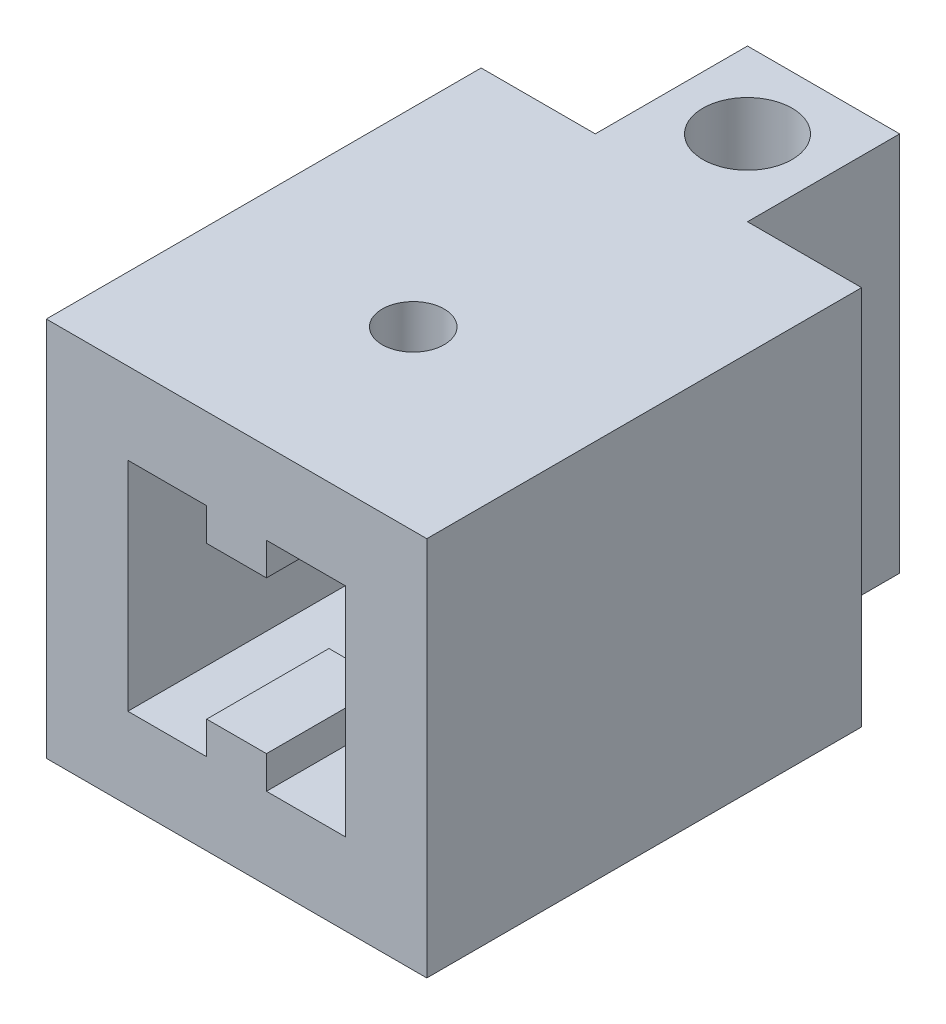
ISO-10303-21;
HEADER;
FILE_DESCRIPTION(('STEP AP214'),'2;1');
FILE_NAME('part.step','',(''),(''),'','','');
FILE_SCHEMA(('AUTOMOTIVE_DESIGN { 1 0 10303 214 1 1 1 1 }'));
ENDSEC;
DATA;
#1=APPLICATION_CONTEXT('core data for automotive mechanical design processes');
#2=APPLICATION_PROTOCOL_DEFINITION('international standard','automotive_design',2000,#1);
#3=PRODUCT_CONTEXT('',#1,'mechanical');
#4=PRODUCT('Part','Part','',(#3));
#5=PRODUCT_RELATED_PRODUCT_CATEGORY('part','',(#4));
#6=PRODUCT_DEFINITION_FORMATION('','',#4);
#7=PRODUCT_DEFINITION_CONTEXT('part definition',#1,'design');
#8=PRODUCT_DEFINITION('design','',#6,#7);
#9=PRODUCT_DEFINITION_SHAPE('','',#8);
#10=(LENGTH_UNIT() NAMED_UNIT(*) SI_UNIT(.MILLI.,.METRE.));
#11=(NAMED_UNIT(*) PLANE_ANGLE_UNIT() SI_UNIT($,.RADIAN.));
#12=(NAMED_UNIT(*) SI_UNIT($,.STERADIAN.) SOLID_ANGLE_UNIT());
#13=UNCERTAINTY_MEASURE_WITH_UNIT(LENGTH_MEASURE(1.E-05),#10,'distance_accuracy_value','');
#14=(GEOMETRIC_REPRESENTATION_CONTEXT(3) GLOBAL_UNCERTAINTY_ASSIGNED_CONTEXT((#13)) GLOBAL_UNIT_ASSIGNED_CONTEXT((#10,
#11,#12)) REPRESENTATION_CONTEXT('',''));
#15=CARTESIAN_POINT('',(0.,0.,0.));
#16=DIRECTION('',(0.,0.,1.));
#17=DIRECTION('',(1.,0.,0.));
#18=AXIS2_PLACEMENT_3D('',#15,#16,#17);
#19=CARTESIAN_POINT('',(0.,0.,-40.));
#20=DIRECTION('',(0.,0.,-1.));
#21=DIRECTION('',(-1.,0.,0.));
#22=AXIS2_PLACEMENT_3D('',#19,#20,#21);
#23=PLANE('',#22);
#24=DIRECTION('',(0.,1.,0.));
#25=VECTOR('',#24,1.);
#26=CARTESIAN_POINT('',(-7.,-17.5,-40.));
#27=LINE('',#26,#25);
#28=CARTESIAN_POINT('',(-7.,-17.5,-40.));
#29=VERTEX_POINT('',#28);
#30=CARTESIAN_POINT('',(-7.,17.5,-40.));
#31=VERTEX_POINT('',#30);
#32=EDGE_CURVE('E249',#29,#31,#27,.T.);
#33=ORIENTED_EDGE('',*,*,#32,.F.);
#34=DIRECTION('',(1.,0.,0.));
#35=VECTOR('',#34,1.);
#36=CARTESIAN_POINT('',(-17.5,-17.5,-40.));
#37=LINE('',#36,#35);
#38=CARTESIAN_POINT('',(-17.5,-17.5,-40.));
#39=VERTEX_POINT('',#38);
#40=EDGE_CURVE('E421',#39,#29,#37,.T.);
#41=ORIENTED_EDGE('',*,*,#40,.F.);
#42=DIRECTION('',(0.,-1.,0.));
#43=VECTOR('',#42,1.);
#44=CARTESIAN_POINT('',(-17.5,-17.5,-40.));
#45=LINE('',#44,#43);
#46=CARTESIAN_POINT('',(-17.5,17.5,-40.));
#47=VERTEX_POINT('',#46);
#48=EDGE_CURVE('E417',#47,#39,#45,.T.);
#49=ORIENTED_EDGE('',*,*,#48,.F.);
#50=DIRECTION('',(-1.,0.,0.));
#51=VECTOR('',#50,1.);
#52=CARTESIAN_POINT('',(-17.5,17.5,-40.));
#53=LINE('',#52,#51);
#54=EDGE_CURVE('E57',#31,#47,#53,.T.);
#55=ORIENTED_EDGE('',*,*,#54,.F.);
#56=EDGE_LOOP('',(#33,#41,#49,#55));
#57=FACE_BOUND('',#56,.T.);
#58=ADVANCED_FACE('F40',(#57),#23,.T.);
#59=CARTESIAN_POINT('',(2.75,0.,-32.5));
#60=DIRECTION('',(-1.,0.,0.));
#61=DIRECTION('',(0.,-1.,0.));
#62=AXIS2_PLACEMENT_3D('',#59,#60,#61);
#63=PLANE('',#62);
#64=DIRECTION('',(0.,0.,1.));
#65=VECTOR('',#64,1.);
#66=CARTESIAN_POINT('',(2.75,-10.,-32.5));
#67=LINE('',#66,#65);
#68=CARTESIAN_POINT('',(2.75,-10.,-11.25));
#69=VERTEX_POINT('',#68);
#70=CARTESIAN_POINT('',(2.75,-10.,0.));
#71=VERTEX_POINT('',#70);
#72=EDGE_CURVE('E394',#69,#71,#67,.T.);
#73=ORIENTED_EDGE('',*,*,#72,.F.);
#74=DIRECTION('',(0.,1.,0.));
#75=VECTOR('',#74,1.);
#76=CARTESIAN_POINT('',(2.75,-10.,-11.25));
#77=LINE('',#76,#75);
#78=CARTESIAN_POINT('',(2.75,-7.,-11.25));
#79=VERTEX_POINT('',#78);
#80=EDGE_CURVE('E271',#69,#79,#77,.T.);
#81=ORIENTED_EDGE('',*,*,#80,.T.);
#82=DIRECTION('',(0.,0.,1.));
#83=VECTOR('',#82,1.);
#84=CARTESIAN_POINT('',(2.75,-7.,-32.5));
#85=LINE('',#84,#83);
#86=CARTESIAN_POINT('',(2.75,-7.,0.));
#87=VERTEX_POINT('',#86);
#88=EDGE_CURVE('E398',#79,#87,#85,.T.);
#89=ORIENTED_EDGE('',*,*,#88,.T.);
#90=DIRECTION('',(0.,-1.,0.));
#91=VECTOR('',#90,1.);
#92=CARTESIAN_POINT('',(2.75,0.,0.));
#93=LINE('',#92,#91);
#94=EDGE_CURVE('E350',#87,#71,#93,.T.);
#95=ORIENTED_EDGE('',*,*,#94,.T.);
#96=EDGE_LOOP('',(#73,#81,#89,#95));
#97=FACE_BOUND('',#96,.T.);
#98=ADVANCED_FACE('F474',(#97),#63,.F.);
#99=CARTESIAN_POINT('',(0.,-7.,-32.5));
#100=DIRECTION('',(0.,-1.,0.));
#101=DIRECTION('',(1.,0.,0.));
#102=AXIS2_PLACEMENT_3D('',#99,#100,#101);
#103=PLANE('',#102);
#104=ORIENTED_EDGE('',*,*,#88,.F.);
#105=DIRECTION('',(1.,0.,0.));
#106=VECTOR('',#105,1.);
#107=CARTESIAN_POINT('',(-2.75,-7.,-11.25));
#108=LINE('',#107,#106);
#109=CARTESIAN_POINT('',(-2.75,-7.,-11.25));
#110=VERTEX_POINT('',#109);
#111=EDGE_CURVE('E264',#110,#79,#108,.T.);
#112=ORIENTED_EDGE('',*,*,#111,.F.);
#113=DIRECTION('',(0.,0.,1.));
#114=VECTOR('',#113,1.);
#115=CARTESIAN_POINT('',(-2.75,-7.,-32.5));
#116=LINE('',#115,#114);
#117=CARTESIAN_POINT('',(-2.75,-7.,0.));
#118=VERTEX_POINT('',#117);
#119=EDGE_CURVE('E402',#110,#118,#116,.T.);
#120=ORIENTED_EDGE('',*,*,#119,.T.);
#121=DIRECTION('',(1.,0.,0.));
#122=VECTOR('',#121,1.);
#123=CARTESIAN_POINT('',(0.,-7.,0.));
#124=LINE('',#123,#122);
#125=EDGE_CURVE('E347',#118,#87,#124,.T.);
#126=ORIENTED_EDGE('',*,*,#125,.T.);
#127=EDGE_LOOP('',(#104,#112,#120,#126));
#128=FACE_BOUND('',#127,.T.);
#129=ADVANCED_FACE('F479',(#128),#103,.F.);
#130=CARTESIAN_POINT('',(-2.75,0.,-32.5));
#131=DIRECTION('',(-1.,0.,0.));
#132=DIRECTION('',(0.,-1.,0.));
#133=AXIS2_PLACEMENT_3D('',#130,#131,#132);
#134=PLANE('',#133);
#135=DIRECTION('',(0.,1.,0.));
#136=VECTOR('',#135,1.);
#137=CARTESIAN_POINT('',(-2.75,-10.,-11.25));
#138=LINE('',#137,#136);
#139=CARTESIAN_POINT('',(-2.75,-10.,-11.25));
#140=VERTEX_POINT('',#139);
#141=EDGE_CURVE('E274',#140,#110,#138,.T.);
#142=ORIENTED_EDGE('',*,*,#141,.F.);
#143=DIRECTION('',(0.,0.,1.));
#144=VECTOR('',#143,1.);
#145=CARTESIAN_POINT('',(-2.75,-10.,-32.5));
#146=LINE('',#145,#144);
#147=CARTESIAN_POINT('',(-2.75,-10.,0.));
#148=VERTEX_POINT('',#147);
#149=EDGE_CURVE('E406',#140,#148,#146,.T.);
#150=ORIENTED_EDGE('',*,*,#149,.T.);
#151=DIRECTION('',(0.,-1.,0.));
#152=VECTOR('',#151,1.);
#153=CARTESIAN_POINT('',(-2.75,0.,0.));
#154=LINE('',#153,#152);
#155=EDGE_CURVE('E344',#118,#148,#154,.T.);
#156=ORIENTED_EDGE('',*,*,#155,.F.);
#157=ORIENTED_EDGE('',*,*,#119,.F.);
#158=EDGE_LOOP('',(#142,#150,#156,#157));
#159=FACE_BOUND('',#158,.T.);
#160=ADVANCED_FACE('F512',(#159),#134,.T.);
#161=CARTESIAN_POINT('',(-2.75,0.,-32.5));
#162=DIRECTION('',(-1.,0.,0.));
#163=DIRECTION('',(0.,-1.,0.));
#164=AXIS2_PLACEMENT_3D('',#161,#162,#163);
#165=PLANE('',#164);
#166=DIRECTION('',(0.,-1.,0.));
#167=VECTOR('',#166,1.);
#168=CARTESIAN_POINT('',(-2.75,10.,-11.25));
#169=LINE('',#168,#167);
#170=CARTESIAN_POINT('',(-2.75,10.,-11.25));
#171=VERTEX_POINT('',#170);
#172=CARTESIAN_POINT('',(-2.75,7.,-11.25));
#173=VERTEX_POINT('',#172);
#174=EDGE_CURVE('E290',#171,#173,#169,.T.);
#175=ORIENTED_EDGE('',*,*,#174,.T.);
#176=DIRECTION('',(0.,0.,1.));
#177=VECTOR('',#176,1.);
#178=CARTESIAN_POINT('',(-2.75,7.,-32.5));
#179=LINE('',#178,#177);
#180=CARTESIAN_POINT('',(-2.75,7.,0.));
#181=VERTEX_POINT('',#180);
#182=EDGE_CURVE('E378',#173,#181,#179,.T.);
#183=ORIENTED_EDGE('',*,*,#182,.T.);
#184=DIRECTION('',(0.,-1.,0.));
#185=VECTOR('',#184,1.);
#186=CARTESIAN_POINT('',(-2.75,0.,0.));
#187=LINE('',#186,#185);
#188=CARTESIAN_POINT('',(-2.75,10.,0.));
#189=VERTEX_POINT('',#188);
#190=EDGE_CURVE('E307',#189,#181,#187,.T.);
#191=ORIENTED_EDGE('',*,*,#190,.F.);
#192=DIRECTION('',(0.,0.,1.));
#193=VECTOR('',#192,1.);
#194=CARTESIAN_POINT('',(-2.75,10.,-32.5));
#195=LINE('',#194,#193);
#196=EDGE_CURVE('E374',#171,#189,#195,.T.);
#197=ORIENTED_EDGE('',*,*,#196,.F.);
#198=EDGE_LOOP('',(#175,#183,#191,#197));
#199=FACE_BOUND('',#198,.T.);
#200=ADVANCED_FACE('F498',(#199),#165,.T.);
#201=CARTESIAN_POINT('',(0.,7.,-32.5));
#202=DIRECTION('',(0.,-1.,0.));
#203=DIRECTION('',(0.,0.,-1.));
#204=AXIS2_PLACEMENT_3D('',#201,#202,#203);
#205=PLANE('',#204);
#206=DIRECTION('',(-1.,0.,0.));
#207=VECTOR('',#206,1.);
#208=CARTESIAN_POINT('',(-2.75,7.,-11.25));
#209=LINE('',#208,#207);
#210=CARTESIAN_POINT('',(2.75,7.,-11.25));
#211=VERTEX_POINT('',#210);
#212=EDGE_CURVE('E276',#211,#173,#209,.T.);
#213=ORIENTED_EDGE('',*,*,#212,.F.);
#214=DIRECTION('',(0.,0.,1.));
#215=VECTOR('',#214,1.);
#216=CARTESIAN_POINT('',(2.75,7.,-32.5));
#217=LINE('',#216,#215);
#218=CARTESIAN_POINT('',(2.75,7.,0.));
#219=VERTEX_POINT('',#218);
#220=EDGE_CURVE('E382',#211,#219,#217,.T.);
#221=ORIENTED_EDGE('',*,*,#220,.T.);
#222=DIRECTION('',(1.,0.,0.));
#223=VECTOR('',#222,1.);
#224=CARTESIAN_POINT('',(0.,7.,0.));
#225=LINE('',#224,#223);
#226=EDGE_CURVE('E365',#181,#219,#225,.T.);
#227=ORIENTED_EDGE('',*,*,#226,.F.);
#228=ORIENTED_EDGE('',*,*,#182,.F.);
#229=EDGE_LOOP('',(#213,#221,#227,#228));
#230=FACE_BOUND('',#229,.T.);
#231=ADVANCED_FACE('F533',(#230),#205,.T.);
#232=CARTESIAN_POINT('',(2.75,0.,-32.5));
#233=DIRECTION('',(-1.,0.,0.));
#234=DIRECTION('',(0.,-1.,0.));
#235=AXIS2_PLACEMENT_3D('',#232,#233,#234);
#236=PLANE('',#235);
#237=ORIENTED_EDGE('',*,*,#220,.F.);
#238=DIRECTION('',(0.,-1.,0.));
#239=VECTOR('',#238,1.);
#240=CARTESIAN_POINT('',(2.75,10.,-11.25));
#241=LINE('',#240,#239);
#242=CARTESIAN_POINT('',(2.75,10.,-11.25));
#243=VERTEX_POINT('',#242);
#244=EDGE_CURVE('E293',#243,#211,#241,.T.);
#245=ORIENTED_EDGE('',*,*,#244,.F.);
#246=DIRECTION('',(0.,0.,1.));
#247=VECTOR('',#246,1.);
#248=CARTESIAN_POINT('',(2.75,10.,-32.5));
#249=LINE('',#248,#247);
#250=CARTESIAN_POINT('',(2.75,10.,0.));
#251=VERTEX_POINT('',#250);
#252=EDGE_CURVE('E386',#243,#251,#249,.T.);
#253=ORIENTED_EDGE('',*,*,#252,.T.);
#254=DIRECTION('',(0.,-1.,0.));
#255=VECTOR('',#254,1.);
#256=CARTESIAN_POINT('',(2.75,0.,0.));
#257=LINE('',#256,#255);
#258=EDGE_CURVE('E362',#251,#219,#257,.T.);
#259=ORIENTED_EDGE('',*,*,#258,.T.);
#260=EDGE_LOOP('',(#237,#245,#253,#259));
#261=FACE_BOUND('',#260,.T.);
#262=ADVANCED_FACE('F530',(#261),#236,.F.);
#263=CARTESIAN_POINT('',(0.,0.,0.));
#264=DIRECTION('',(0.,0.,-1.));
#265=DIRECTION('',(-1.,0.,0.));
#266=AXIS2_PLACEMENT_3D('',#263,#264,#265);
#267=PLANE('',#266);
#268=DIRECTION('',(0.,1.,0.));
#269=VECTOR('',#268,1.);
#270=CARTESIAN_POINT('',(17.5,-17.5,0.));
#271=LINE('',#270,#269);
#272=CARTESIAN_POINT('',(17.5,-17.5,0.));
#273=VERTEX_POINT('',#272);
#274=CARTESIAN_POINT('',(17.5,17.5,0.));
#275=VERTEX_POINT('',#274);
#276=EDGE_CURVE('E373',#273,#275,#271,.T.);
#277=ORIENTED_EDGE('',*,*,#276,.T.);
#278=DIRECTION('',(-1.,0.,0.));
#279=VECTOR('',#278,1.);
#280=CARTESIAN_POINT('',(-17.5,17.5,0.));
#281=LINE('',#280,#279);
#282=CARTESIAN_POINT('',(-17.5,17.5,0.));
#283=VERTEX_POINT('',#282);
#284=EDGE_CURVE('E427',#275,#283,#281,.T.);
#285=ORIENTED_EDGE('',*,*,#284,.T.);
#286=DIRECTION('',(0.,-1.,0.));
#287=VECTOR('',#286,1.);
#288=CARTESIAN_POINT('',(-17.5,-17.5,0.));
#289=LINE('',#288,#287);
#290=CARTESIAN_POINT('',(-17.5,-17.5,0.));
#291=VERTEX_POINT('',#290);
#292=EDGE_CURVE('E430',#283,#291,#289,.T.);
#293=ORIENTED_EDGE('',*,*,#292,.T.);
#294=DIRECTION('',(1.,0.,0.));
#295=VECTOR('',#294,1.);
#296=CARTESIAN_POINT('',(-17.5,-17.5,0.));
#297=LINE('',#296,#295);
#298=EDGE_CURVE('E414',#291,#273,#297,.T.);
#299=ORIENTED_EDGE('',*,*,#298,.T.);
#300=EDGE_LOOP('',(#277,#285,#293,#299));
#301=FACE_BOUND('',#300,.T.);
#302=DIRECTION('',(1.,0.,0.));
#303=VECTOR('',#302,1.);
#304=CARTESIAN_POINT('',(0.,10.,0.));
#305=LINE('',#304,#303);
#306=CARTESIAN_POINT('',(-10.,10.,0.));
#307=VERTEX_POINT('',#306);
#308=EDGE_CURVE('E295',#307,#189,#305,.T.);
#309=ORIENTED_EDGE('',*,*,#308,.T.);
#310=ORIENTED_EDGE('',*,*,#190,.T.);
#311=ORIENTED_EDGE('',*,*,#226,.T.);
#312=ORIENTED_EDGE('',*,*,#258,.F.);
#313=DIRECTION('',(1.,0.,0.));
#314=VECTOR('',#313,1.);
#315=CARTESIAN_POINT('',(0.,10.,0.));
#316=LINE('',#315,#314);
#317=CARTESIAN_POINT('',(10.,10.,0.));
#318=VERTEX_POINT('',#317);
#319=EDGE_CURVE('E359',#251,#318,#316,.T.);
#320=ORIENTED_EDGE('',*,*,#319,.T.);
#321=DIRECTION('',(0.,-1.,0.));
#322=VECTOR('',#321,1.);
#323=CARTESIAN_POINT('',(10.,0.,0.));
#324=LINE('',#323,#322);
#325=CARTESIAN_POINT('',(10.,-10.,0.));
#326=VERTEX_POINT('',#325);
#327=EDGE_CURVE('E356',#318,#326,#324,.T.);
#328=ORIENTED_EDGE('',*,*,#327,.T.);
#329=DIRECTION('',(1.,0.,0.));
#330=VECTOR('',#329,1.);
#331=CARTESIAN_POINT('',(0.,-10.,0.));
#332=LINE('',#331,#330);
#333=EDGE_CURVE('E353',#71,#326,#332,.T.);
#334=ORIENTED_EDGE('',*,*,#333,.F.);
#335=ORIENTED_EDGE('',*,*,#94,.F.);
#336=ORIENTED_EDGE('',*,*,#125,.F.);
#337=ORIENTED_EDGE('',*,*,#155,.T.);
#338=DIRECTION('',(1.,0.,0.));
#339=VECTOR('',#338,1.);
#340=CARTESIAN_POINT('',(0.,-10.,0.));
#341=LINE('',#340,#339);
#342=CARTESIAN_POINT('',(-10.,-10.,0.));
#343=VERTEX_POINT('',#342);
#344=EDGE_CURVE('E341',#343,#148,#341,.T.);
#345=ORIENTED_EDGE('',*,*,#344,.F.);
#346=DIRECTION('',(0.,-1.,0.));
#347=VECTOR('',#346,1.);
#348=CARTESIAN_POINT('',(-10.,0.,0.));
#349=LINE('',#348,#347);
#350=EDGE_CURVE('E338',#307,#343,#349,.T.);
#351=ORIENTED_EDGE('',*,*,#350,.F.);
#352=EDGE_LOOP('',(#309,#310,#311,#312,#320,#328,#334,#335,#336,#337,#345,#351));
#353=FACE_BOUND('',#352,.T.);
#354=ADVANCED_FACE('F444',(#301,#353),#267,.F.);
#355=CARTESIAN_POINT('',(17.5,-17.5,-40.));
#356=DIRECTION('',(1.,0.,0.));
#357=DIRECTION('',(0.,0.,-1.));
#358=AXIS2_PLACEMENT_3D('',#355,#356,#357);
#359=PLANE('',#358);
#360=ORIENTED_EDGE('',*,*,#276,.F.);
#361=DIRECTION('',(0.,0.,1.));
#362=VECTOR('',#361,1.);
#363=CARTESIAN_POINT('',(17.5,-17.5,-40.));
#364=LINE('',#363,#362);
#365=CARTESIAN_POINT('',(17.5,-17.5,-40.));
#366=VERTEX_POINT('',#365);
#367=EDGE_CURVE('E12',#366,#273,#364,.T.);
#368=ORIENTED_EDGE('',*,*,#367,.F.);
#369=DIRECTION('',(0.,1.,0.));
#370=VECTOR('',#369,1.);
#371=CARTESIAN_POINT('',(17.5,-17.5,-40.));
#372=LINE('',#371,#370);
#373=CARTESIAN_POINT('',(17.5,17.5,-40.));
#374=VERTEX_POINT('',#373);
#375=EDGE_CURVE('E411',#366,#374,#372,.T.);
#376=ORIENTED_EDGE('',*,*,#375,.T.);
#377=DIRECTION('',(0.,0.,1.));
#378=VECTOR('',#377,1.);
#379=CARTESIAN_POINT('',(17.5,17.5,-40.));
#380=LINE('',#379,#378);
#381=EDGE_CURVE('E424',#374,#275,#380,.T.);
#382=ORIENTED_EDGE('',*,*,#381,.T.);
#383=EDGE_LOOP('',(#360,#368,#376,#382));
#384=FACE_BOUND('',#383,.T.);
#385=ADVANCED_FACE('F42',(#384),#359,.T.);
#386=CARTESIAN_POINT('',(-17.5,-17.5,-40.));
#387=DIRECTION('',(0.,-1.,0.));
#388=DIRECTION('',(0.,0.,-1.));
#389=AXIS2_PLACEMENT_3D('',#386,#387,#388);
#390=PLANE('',#389);
#391=CARTESIAN_POINT('',(0.,-17.5,-47.));
#392=DIRECTION('',(0.,-1.,0.));
#393=DIRECTION('',(0.,0.,-1.));
#394=AXIS2_PLACEMENT_3D('',#391,#392,#393);
#395=CIRCLE('',#394,4.1);
#396=CARTESIAN_POINT('',(0.,-17.5,-51.1));
#397=VERTEX_POINT('',#396);
#398=EDGE_CURVE('E575',#397,#397,#395,.T.);
#399=ORIENTED_EDGE('',*,*,#398,.F.);
#400=EDGE_LOOP('',(#399));
#401=FACE_BOUND('',#400,.T.);
#402=CARTESIAN_POINT('',(0.,-17.5,-16.25));
#403=DIRECTION('',(0.,1.,0.));
#404=DIRECTION('',(0.,0.,1.));
#405=AXIS2_PLACEMENT_3D('',#402,#403,#404);
#406=CIRCLE('',#405,2.85);
#407=CARTESIAN_POINT('',(0.,-17.5,-13.4));
#408=VERTEX_POINT('',#407);
#409=EDGE_CURVE('E253',#408,#408,#406,.T.);
#410=ORIENTED_EDGE('',*,*,#409,.T.);
#411=EDGE_LOOP('',(#410));
#412=FACE_BOUND('',#411,.T.);
#413=ORIENTED_EDGE('',*,*,#298,.F.);
#414=DIRECTION('',(0.,0.,1.));
#415=VECTOR('',#414,1.);
#416=CARTESIAN_POINT('',(-17.5,-17.5,-40.));
#417=LINE('',#416,#415);
#418=EDGE_CURVE('E49',#39,#291,#417,.T.);
#419=ORIENTED_EDGE('',*,*,#418,.F.);
#420=ORIENTED_EDGE('',*,*,#40,.T.);
#421=DIRECTION('',(0.,0.,1.));
#422=VECTOR('',#421,1.);
#423=CARTESIAN_POINT('',(-7.,-17.5,-54.));
#424=LINE('',#423,#422);
#425=CARTESIAN_POINT('',(-7.,-17.5,-54.));
#426=VERTEX_POINT('',#425);
#427=EDGE_CURVE('E455',#426,#29,#424,.T.);
#428=ORIENTED_EDGE('',*,*,#427,.F.);
#429=DIRECTION('',(-1.,0.,0.));
#430=VECTOR('',#429,1.);
#431=CARTESIAN_POINT('',(7.,-17.5,-54.));
#432=LINE('',#431,#430);
#433=CARTESIAN_POINT('',(7.,-17.5,-54.));
#434=VERTEX_POINT('',#433);
#435=EDGE_CURVE('E243',#434,#426,#432,.T.);
#436=ORIENTED_EDGE('',*,*,#435,.F.);
#437=DIRECTION('',(0.,0.,1.));
#438=VECTOR('',#437,1.);
#439=CARTESIAN_POINT('',(7.,-17.5,-54.));
#440=LINE('',#439,#438);
#441=CARTESIAN_POINT('',(7.,-17.5,-40.));
#442=VERTEX_POINT('',#441);
#443=EDGE_CURVE('E255',#434,#442,#440,.T.);
#444=ORIENTED_EDGE('',*,*,#443,.T.);
#445=EDGE_CURVE('E420',#442,#366,#37,.T.);
#446=ORIENTED_EDGE('',*,*,#445,.T.);
#447=ORIENTED_EDGE('',*,*,#367,.T.);
#448=EDGE_LOOP('',(#413,#419,#420,#428,#436,#444,#446,#447));
#449=FACE_BOUND('',#448,.T.);
#450=ADVANCED_FACE('F448',(#401,#412,#449),#390,.T.);
#451=CARTESIAN_POINT('',(-17.5,-17.5,-40.));
#452=DIRECTION('',(-1.,0.,0.));
#453=DIRECTION('',(0.,0.,1.));
#454=AXIS2_PLACEMENT_3D('',#451,#452,#453);
#455=PLANE('',#454);
#456=ORIENTED_EDGE('',*,*,#292,.F.);
#457=DIRECTION('',(0.,0.,1.));
#458=VECTOR('',#457,1.);
#459=CARTESIAN_POINT('',(-17.5,17.5,-40.));
#460=LINE('',#459,#458);
#461=EDGE_CURVE('E436',#47,#283,#460,.T.);
#462=ORIENTED_EDGE('',*,*,#461,.F.);
#463=ORIENTED_EDGE('',*,*,#48,.T.);
#464=ORIENTED_EDGE('',*,*,#418,.T.);
#465=EDGE_LOOP('',(#456,#462,#463,#464));
#466=FACE_BOUND('',#465,.T.);
#467=ADVANCED_FACE('F463',(#466),#455,.T.);
#468=CARTESIAN_POINT('',(-17.5,17.5,-40.));
#469=DIRECTION('',(0.,1.,0.));
#470=DIRECTION('',(0.,0.,1.));
#471=AXIS2_PLACEMENT_3D('',#468,#469,#470);
#472=PLANE('',#471);
#473=CARTESIAN_POINT('',(0.,17.5,-47.));
#474=DIRECTION('',(0.,-1.,0.));
#475=DIRECTION('',(0.,0.,-1.));
#476=AXIS2_PLACEMENT_3D('',#473,#474,#475);
#477=CIRCLE('',#476,4.1);
#478=CARTESIAN_POINT('',(0.,17.5,-51.1));
#479=VERTEX_POINT('',#478);
#480=EDGE_CURVE('E459',#479,#479,#477,.T.);
#481=ORIENTED_EDGE('',*,*,#480,.T.);
#482=EDGE_LOOP('',(#481));
#483=FACE_BOUND('',#482,.T.);
#484=CARTESIAN_POINT('',(0.,17.5,-16.25));
#485=DIRECTION('',(0.,1.,0.));
#486=DIRECTION('',(0.,0.,1.));
#487=AXIS2_PLACEMENT_3D('',#484,#485,#486);
#488=CIRCLE('',#487,2.85);
#489=CARTESIAN_POINT('',(0.,17.5,-13.4));
#490=VERTEX_POINT('',#489);
#491=EDGE_CURVE('E250',#490,#490,#488,.T.);
#492=ORIENTED_EDGE('',*,*,#491,.F.);
#493=EDGE_LOOP('',(#492));
#494=FACE_BOUND('',#493,.T.);
#495=ORIENTED_EDGE('',*,*,#284,.F.);
#496=ORIENTED_EDGE('',*,*,#381,.F.);
#497=CARTESIAN_POINT('',(7.,17.5,-40.));
#498=VERTEX_POINT('',#497);
#499=EDGE_CURVE('E415',#374,#498,#53,.T.);
#500=ORIENTED_EDGE('',*,*,#499,.T.);
#501=DIRECTION('',(0.,0.,1.));
#502=VECTOR('',#501,1.);
#503=CARTESIAN_POINT('',(7.,17.5,-54.));
#504=LINE('',#503,#502);
#505=CARTESIAN_POINT('',(7.,17.5,-54.));
#506=VERTEX_POINT('',#505);
#507=EDGE_CURVE('E234',#506,#498,#504,.T.);
#508=ORIENTED_EDGE('',*,*,#507,.F.);
#509=DIRECTION('',(1.,0.,0.));
#510=VECTOR('',#509,1.);
#511=CARTESIAN_POINT('',(-7.,17.5,-54.));
#512=LINE('',#511,#510);
#513=CARTESIAN_POINT('',(-7.,17.5,-54.));
#514=VERTEX_POINT('',#513);
#515=EDGE_CURVE('E226',#514,#506,#512,.T.);
#516=ORIENTED_EDGE('',*,*,#515,.F.);
#517=DIRECTION('',(0.,0.,1.));
#518=VECTOR('',#517,1.);
#519=CARTESIAN_POINT('',(-7.,17.5,-54.));
#520=LINE('',#519,#518);
#521=EDGE_CURVE('E231',#514,#31,#520,.T.);
#522=ORIENTED_EDGE('',*,*,#521,.T.);
#523=ORIENTED_EDGE('',*,*,#54,.T.);
#524=ORIENTED_EDGE('',*,*,#461,.T.);
#525=EDGE_LOOP('',(#495,#496,#500,#508,#516,#522,#523,#524));
#526=FACE_BOUND('',#525,.T.);
#527=ADVANCED_FACE('F229',(#483,#494,#526),#472,.T.);
#528=DIRECTION('',(0.,-1.,0.));
#529=VECTOR('',#528,1.);
#530=CARTESIAN_POINT('',(7.,17.5,-40.));
#531=LINE('',#530,#529);
#532=EDGE_CURVE('E65',#498,#442,#531,.T.);
#533=ORIENTED_EDGE('',*,*,#532,.F.);
#534=ORIENTED_EDGE('',*,*,#499,.F.);
#535=ORIENTED_EDGE('',*,*,#375,.F.);
#536=ORIENTED_EDGE('',*,*,#445,.F.);
#537=EDGE_LOOP('',(#533,#534,#535,#536));
#538=FACE_BOUND('',#537,.T.);
#539=ADVANCED_FACE('F450',(#538),#23,.T.);
#540=CARTESIAN_POINT('',(0.,10.,-32.5));
#541=DIRECTION('',(0.,-1.,0.));
#542=DIRECTION('',(0.,0.,-1.));
#543=AXIS2_PLACEMENT_3D('',#540,#541,#542);
#544=PLANE('',#543);
#545=CARTESIAN_POINT('',(0.,10.,-16.25));
#546=DIRECTION('',(0.,-1.,0.));
#547=DIRECTION('',(0.,0.,-1.));
#548=AXIS2_PLACEMENT_3D('',#545,#546,#547);
#549=CIRCLE('',#548,2.85);
#550=CARTESIAN_POINT('',(0.,10.,-19.1));
#551=VERTEX_POINT('',#550);
#552=EDGE_CURVE('E261',#551,#551,#549,.T.);
#553=ORIENTED_EDGE('',*,*,#552,.F.);
#554=EDGE_LOOP('',(#553));
#555=FACE_BOUND('',#554,.T.);
#556=ORIENTED_EDGE('',*,*,#308,.F.);
#557=DIRECTION('',(0.,0.,1.));
#558=VECTOR('',#557,1.);
#559=CARTESIAN_POINT('',(-10.,10.,-32.5));
#560=LINE('',#559,#558);
#561=CARTESIAN_POINT('',(-10.,10.,-32.5));
#562=VERTEX_POINT('',#561);
#563=EDGE_CURVE('E335',#562,#307,#560,.T.);
#564=ORIENTED_EDGE('',*,*,#563,.F.);
#565=DIRECTION('',(1.,0.,0.));
#566=VECTOR('',#565,1.);
#567=CARTESIAN_POINT('',(0.,10.,-32.5));
#568=LINE('',#567,#566);
#569=CARTESIAN_POINT('',(-2.75,10.,-32.5));
#570=VERTEX_POINT('',#569);
#571=EDGE_CURVE('E303',#562,#570,#568,.T.);
#572=ORIENTED_EDGE('',*,*,#571,.T.);
#573=CARTESIAN_POINT('',(-2.75,10.,-21.25));
#574=VERTEX_POINT('',#573);
#575=EDGE_CURVE('E370',#570,#574,#195,.T.);
#576=ORIENTED_EDGE('',*,*,#575,.T.);
#577=DIRECTION('',(1.,0.,0.));
#578=VECTOR('',#577,1.);
#579=CARTESIAN_POINT('',(2.75,10.,-21.25));
#580=LINE('',#579,#578);
#581=CARTESIAN_POINT('',(2.75,10.,-21.25));
#582=VERTEX_POINT('',#581);
#583=EDGE_CURVE('E287',#574,#582,#580,.T.);
#584=ORIENTED_EDGE('',*,*,#583,.T.);
#585=CARTESIAN_POINT('',(2.75,10.,-32.5));
#586=VERTEX_POINT('',#585);
#587=EDGE_CURVE('E383',#586,#582,#249,.T.);
#588=ORIENTED_EDGE('',*,*,#587,.F.);
#589=DIRECTION('',(1.,0.,0.));
#590=VECTOR('',#589,1.);
#591=CARTESIAN_POINT('',(0.,10.,-32.5));
#592=LINE('',#591,#590);
#593=CARTESIAN_POINT('',(10.,10.,-32.5));
#594=VERTEX_POINT('',#593);
#595=EDGE_CURVE('E326',#586,#594,#592,.T.);
#596=ORIENTED_EDGE('',*,*,#595,.T.);
#597=DIRECTION('',(0.,0.,1.));
#598=VECTOR('',#597,1.);
#599=CARTESIAN_POINT('',(10.,10.,-32.5));
#600=LINE('',#599,#598);
#601=EDGE_CURVE('E387',#594,#318,#600,.T.);
#602=ORIENTED_EDGE('',*,*,#601,.T.);
#603=ORIENTED_EDGE('',*,*,#319,.F.);
#604=ORIENTED_EDGE('',*,*,#252,.F.);
#605=DIRECTION('',(-1.,0.,0.));
#606=VECTOR('',#605,1.);
#607=CARTESIAN_POINT('',(-2.75,10.,-11.25));
#608=LINE('',#607,#606);
#609=EDGE_CURVE('E284',#243,#171,#608,.T.);
#610=ORIENTED_EDGE('',*,*,#609,.T.);
#611=ORIENTED_EDGE('',*,*,#196,.T.);
#612=EDGE_LOOP('',(#556,#564,#572,#576,#584,#588,#596,#602,#603,#604,#610,#611));
#613=FACE_BOUND('',#612,.T.);
#614=ADVANCED_FACE('F486',(#555,#613),#544,.T.);
#615=DIRECTION('',(0.,-1.,0.));
#616=VECTOR('',#615,1.);
#617=CARTESIAN_POINT('',(-2.75,10.,-21.25));
#618=LINE('',#617,#616);
#619=CARTESIAN_POINT('',(-2.75,7.,-21.25));
#620=VERTEX_POINT('',#619);
#621=EDGE_CURVE('E299',#574,#620,#618,.T.);
#622=ORIENTED_EDGE('',*,*,#621,.F.);
#623=ORIENTED_EDGE('',*,*,#575,.F.);
#624=DIRECTION('',(0.,-1.,0.));
#625=VECTOR('',#624,1.);
#626=CARTESIAN_POINT('',(-2.75,0.,-32.5));
#627=LINE('',#626,#625);
#628=CARTESIAN_POINT('',(-2.75,7.,-32.5));
#629=VERTEX_POINT('',#628);
#630=EDGE_CURVE('E333',#570,#629,#627,.T.);
#631=ORIENTED_EDGE('',*,*,#630,.T.);
#632=EDGE_CURVE('E375',#629,#620,#179,.T.);
#633=ORIENTED_EDGE('',*,*,#632,.T.);
#634=EDGE_LOOP('',(#622,#623,#631,#633));
#635=FACE_BOUND('',#634,.T.);
#636=ADVANCED_FACE('F490',(#635),#165,.T.);
#637=DIRECTION('',(1.,0.,0.));
#638=VECTOR('',#637,1.);
#639=CARTESIAN_POINT('',(2.75,7.,-21.25));
#640=LINE('',#639,#638);
#641=CARTESIAN_POINT('',(2.75,7.,-21.25));
#642=VERTEX_POINT('',#641);
#643=EDGE_CURVE('E288',#620,#642,#640,.T.);
#644=ORIENTED_EDGE('',*,*,#643,.F.);
#645=ORIENTED_EDGE('',*,*,#632,.F.);
#646=DIRECTION('',(1.,0.,0.));
#647=VECTOR('',#646,1.);
#648=CARTESIAN_POINT('',(0.,7.,-32.5));
#649=LINE('',#648,#647);
#650=CARTESIAN_POINT('',(2.75,7.,-32.5));
#651=VERTEX_POINT('',#650);
#652=EDGE_CURVE('E331',#629,#651,#649,.T.);
#653=ORIENTED_EDGE('',*,*,#652,.T.);
#654=EDGE_CURVE('E379',#651,#642,#217,.T.);
#655=ORIENTED_EDGE('',*,*,#654,.T.);
#656=EDGE_LOOP('',(#644,#645,#653,#655));
#657=FACE_BOUND('',#656,.T.);
#658=ADVANCED_FACE('F495',(#657),#205,.T.);
#659=ORIENTED_EDGE('',*,*,#587,.T.);
#660=DIRECTION('',(0.,-1.,0.));
#661=VECTOR('',#660,1.);
#662=CARTESIAN_POINT('',(2.75,10.,-21.25));
#663=LINE('',#662,#661);
#664=EDGE_CURVE('E296',#582,#642,#663,.T.);
#665=ORIENTED_EDGE('',*,*,#664,.T.);
#666=ORIENTED_EDGE('',*,*,#654,.F.);
#667=DIRECTION('',(0.,-1.,0.));
#668=VECTOR('',#667,1.);
#669=CARTESIAN_POINT('',(2.75,0.,-32.5));
#670=LINE('',#669,#668);
#671=EDGE_CURVE('E328',#586,#651,#670,.T.);
#672=ORIENTED_EDGE('',*,*,#671,.F.);
#673=EDGE_LOOP('',(#659,#665,#666,#672));
#674=FACE_BOUND('',#673,.T.);
#675=ADVANCED_FACE('F525',(#674),#236,.F.);
#676=CARTESIAN_POINT('',(10.,0.,-32.5));
#677=DIRECTION('',(-1.,0.,0.));
#678=DIRECTION('',(0.,0.,1.));
#679=AXIS2_PLACEMENT_3D('',#676,#677,#678);
#680=PLANE('',#679);
#681=ORIENTED_EDGE('',*,*,#327,.F.);
#682=ORIENTED_EDGE('',*,*,#601,.F.);
#683=DIRECTION('',(0.,-1.,0.));
#684=VECTOR('',#683,1.);
#685=CARTESIAN_POINT('',(10.,0.,-32.5));
#686=LINE('',#685,#684);
#687=CARTESIAN_POINT('',(10.,-10.,-32.5));
#688=VERTEX_POINT('',#687);
#689=EDGE_CURVE('E324',#594,#688,#686,.T.);
#690=ORIENTED_EDGE('',*,*,#689,.T.);
#691=DIRECTION('',(0.,0.,1.));
#692=VECTOR('',#691,1.);
#693=CARTESIAN_POINT('',(10.,-10.,-32.5));
#694=LINE('',#693,#692);
#695=EDGE_CURVE('E389',#688,#326,#694,.T.);
#696=ORIENTED_EDGE('',*,*,#695,.T.);
#697=EDGE_LOOP('',(#681,#682,#690,#696));
#698=FACE_BOUND('',#697,.T.);
#699=ADVANCED_FACE('F521',(#698),#680,.T.);
#700=CARTESIAN_POINT('',(0.,-10.,-32.5));
#701=DIRECTION('',(0.,-1.,0.));
#702=DIRECTION('',(0.,0.,-1.));
#703=AXIS2_PLACEMENT_3D('',#700,#701,#702);
#704=PLANE('',#703);
#705=CARTESIAN_POINT('',(0.,-10.,-16.25));
#706=DIRECTION('',(0.,-1.,0.));
#707=DIRECTION('',(0.,0.,-1.));
#708=AXIS2_PLACEMENT_3D('',#705,#706,#707);
#709=CIRCLE('',#708,2.85);
#710=CARTESIAN_POINT('',(0.,-10.,-19.1));
#711=VERTEX_POINT('',#710);
#712=EDGE_CURVE('E44',#711,#711,#709,.T.);
#713=ORIENTED_EDGE('',*,*,#712,.T.);
#714=EDGE_LOOP('',(#713));
#715=FACE_BOUND('',#714,.T.);
#716=ORIENTED_EDGE('',*,*,#333,.T.);
#717=ORIENTED_EDGE('',*,*,#695,.F.);
#718=DIRECTION('',(1.,0.,0.));
#719=VECTOR('',#718,1.);
#720=CARTESIAN_POINT('',(0.,-10.,-32.5));
#721=LINE('',#720,#719);
#722=CARTESIAN_POINT('',(2.75,-10.,-32.5));
#723=VERTEX_POINT('',#722);
#724=EDGE_CURVE('E321',#723,#688,#721,.T.);
#725=ORIENTED_EDGE('',*,*,#724,.F.);
#726=CARTESIAN_POINT('',(2.75,-10.,-21.25));
#727=VERTEX_POINT('',#726);
#728=EDGE_CURVE('E391',#723,#727,#67,.T.);
#729=ORIENTED_EDGE('',*,*,#728,.T.);
#730=DIRECTION('',(-1.,0.,0.));
#731=VECTOR('',#730,1.);
#732=CARTESIAN_POINT('',(2.75,-10.,-21.25));
#733=LINE('',#732,#731);
#734=CARTESIAN_POINT('',(-2.75,-10.,-21.25));
#735=VERTEX_POINT('',#734);
#736=EDGE_CURVE('E268',#727,#735,#733,.T.);
#737=ORIENTED_EDGE('',*,*,#736,.T.);
#738=CARTESIAN_POINT('',(-2.75,-10.,-32.5));
#739=VERTEX_POINT('',#738);
#740=EDGE_CURVE('E403',#739,#735,#146,.T.);
#741=ORIENTED_EDGE('',*,*,#740,.F.);
#742=DIRECTION('',(1.,0.,0.));
#743=VECTOR('',#742,1.);
#744=CARTESIAN_POINT('',(0.,-10.,-32.5));
#745=LINE('',#744,#743);
#746=CARTESIAN_POINT('',(-10.,-10.,-32.5));
#747=VERTEX_POINT('',#746);
#748=EDGE_CURVE('E310',#747,#739,#745,.T.);
#749=ORIENTED_EDGE('',*,*,#748,.F.);
#750=DIRECTION('',(0.,0.,1.));
#751=VECTOR('',#750,1.);
#752=CARTESIAN_POINT('',(-10.,-10.,-32.5));
#753=LINE('',#752,#751);
#754=EDGE_CURVE('E407',#747,#343,#753,.T.);
#755=ORIENTED_EDGE('',*,*,#754,.T.);
#756=ORIENTED_EDGE('',*,*,#344,.T.);
#757=ORIENTED_EDGE('',*,*,#149,.F.);
#758=DIRECTION('',(1.,0.,0.));
#759=VECTOR('',#758,1.);
#760=CARTESIAN_POINT('',(-2.75,-10.,-11.25));
#761=LINE('',#760,#759);
#762=EDGE_CURVE('E265',#140,#69,#761,.T.);
#763=ORIENTED_EDGE('',*,*,#762,.T.);
#764=ORIENTED_EDGE('',*,*,#72,.T.);
#765=EDGE_LOOP('',(#716,#717,#725,#729,#737,#741,#749,#755,#756,#757,#763,#764));
#766=FACE_BOUND('',#765,.T.);
#767=ADVANCED_FACE('F517',(#715,#766),#704,.F.);
#768=CARTESIAN_POINT('',(2.75,-7.,-32.5));
#769=VERTEX_POINT('',#768);
#770=CARTESIAN_POINT('',(2.75,-7.,-21.25));
#771=VERTEX_POINT('',#770);
#772=EDGE_CURVE('E395',#769,#771,#85,.T.);
#773=ORIENTED_EDGE('',*,*,#772,.T.);
#774=DIRECTION('',(0.,1.,0.));
#775=VECTOR('',#774,1.);
#776=CARTESIAN_POINT('',(2.75,-10.,-21.25));
#777=LINE('',#776,#775);
#778=EDGE_CURVE('E280',#727,#771,#777,.T.);
#779=ORIENTED_EDGE('',*,*,#778,.F.);
#780=ORIENTED_EDGE('',*,*,#728,.F.);
#781=DIRECTION('',(0.,-1.,0.));
#782=VECTOR('',#781,1.);
#783=CARTESIAN_POINT('',(2.75,0.,-32.5));
#784=LINE('',#783,#782);
#785=EDGE_CURVE('E318',#769,#723,#784,.T.);
#786=ORIENTED_EDGE('',*,*,#785,.F.);
#787=EDGE_LOOP('',(#773,#779,#780,#786));
#788=FACE_BOUND('',#787,.T.);
#789=ADVANCED_FACE('F482',(#788),#63,.F.);
#790=CARTESIAN_POINT('',(-2.75,-7.,-32.5));
#791=VERTEX_POINT('',#790);
#792=CARTESIAN_POINT('',(-2.75,-7.,-21.25));
#793=VERTEX_POINT('',#792);
#794=EDGE_CURVE('E399',#791,#793,#116,.T.);
#795=ORIENTED_EDGE('',*,*,#794,.T.);
#796=DIRECTION('',(-1.,0.,0.));
#797=VECTOR('',#796,1.);
#798=CARTESIAN_POINT('',(2.75,-7.,-21.25));
#799=LINE('',#798,#797);
#800=EDGE_CURVE('E269',#771,#793,#799,.T.);
#801=ORIENTED_EDGE('',*,*,#800,.F.);
#802=ORIENTED_EDGE('',*,*,#772,.F.);
#803=DIRECTION('',(1.,0.,0.));
#804=VECTOR('',#803,1.);
#805=CARTESIAN_POINT('',(0.,-7.,-32.5));
#806=LINE('',#805,#804);
#807=EDGE_CURVE('E315',#791,#769,#806,.T.);
#808=ORIENTED_EDGE('',*,*,#807,.F.);
#809=EDGE_LOOP('',(#795,#801,#802,#808));
#810=FACE_BOUND('',#809,.T.);
#811=ADVANCED_FACE('F510',(#810),#103,.F.);
#812=DIRECTION('',(0.,1.,0.));
#813=VECTOR('',#812,1.);
#814=CARTESIAN_POINT('',(-2.75,-10.,-21.25));
#815=LINE('',#814,#813);
#816=EDGE_CURVE('E277',#735,#793,#815,.T.);
#817=ORIENTED_EDGE('',*,*,#816,.T.);
#818=ORIENTED_EDGE('',*,*,#794,.F.);
#819=DIRECTION('',(0.,-1.,0.));
#820=VECTOR('',#819,1.);
#821=CARTESIAN_POINT('',(-2.75,0.,-32.5));
#822=LINE('',#821,#820);
#823=EDGE_CURVE('E313',#791,#739,#822,.T.);
#824=ORIENTED_EDGE('',*,*,#823,.T.);
#825=ORIENTED_EDGE('',*,*,#740,.T.);
#826=EDGE_LOOP('',(#817,#818,#824,#825));
#827=FACE_BOUND('',#826,.T.);
#828=ADVANCED_FACE('F506',(#827),#134,.T.);
#829=CARTESIAN_POINT('',(-10.,0.,-32.5));
#830=DIRECTION('',(-1.,0.,0.));
#831=DIRECTION('',(0.,0.,1.));
#832=AXIS2_PLACEMENT_3D('',#829,#830,#831);
#833=PLANE('',#832);
#834=ORIENTED_EDGE('',*,*,#350,.T.);
#835=ORIENTED_EDGE('',*,*,#754,.F.);
#836=DIRECTION('',(0.,-1.,0.));
#837=VECTOR('',#836,1.);
#838=CARTESIAN_POINT('',(-10.,0.,-32.5));
#839=LINE('',#838,#837);
#840=EDGE_CURVE('E306',#562,#747,#839,.T.);
#841=ORIENTED_EDGE('',*,*,#840,.F.);
#842=ORIENTED_EDGE('',*,*,#563,.T.);
#843=EDGE_LOOP('',(#834,#835,#841,#842));
#844=FACE_BOUND('',#843,.T.);
#845=ADVANCED_FACE('F502',(#844),#833,.F.);
#846=CARTESIAN_POINT('',(0.,0.,-32.5));
#847=DIRECTION('',(0.,0.,1.));
#848=DIRECTION('',(1.,0.,0.));
#849=AXIS2_PLACEMENT_3D('',#846,#847,#848);
#850=PLANE('',#849);
#851=ORIENTED_EDGE('',*,*,#571,.F.);
#852=ORIENTED_EDGE('',*,*,#840,.T.);
#853=ORIENTED_EDGE('',*,*,#748,.T.);
#854=ORIENTED_EDGE('',*,*,#823,.F.);
#855=ORIENTED_EDGE('',*,*,#807,.T.);
#856=ORIENTED_EDGE('',*,*,#785,.T.);
#857=ORIENTED_EDGE('',*,*,#724,.T.);
#858=ORIENTED_EDGE('',*,*,#689,.F.);
#859=ORIENTED_EDGE('',*,*,#595,.F.);
#860=ORIENTED_EDGE('',*,*,#671,.T.);
#861=ORIENTED_EDGE('',*,*,#652,.F.);
#862=ORIENTED_EDGE('',*,*,#630,.F.);
#863=EDGE_LOOP('',(#851,#852,#853,#854,#855,#856,#857,#858,#859,#860,#861,#862));
#864=FACE_BOUND('',#863,.T.);
#865=ADVANCED_FACE('F505',(#864),#850,.T.);
#866=CARTESIAN_POINT('',(-2.75,10.,-11.25));
#867=DIRECTION('',(0.,0.,1.));
#868=DIRECTION('',(1.,0.,0.));
#869=AXIS2_PLACEMENT_3D('',#866,#867,#868);
#870=PLANE('',#869);
#871=ORIENTED_EDGE('',*,*,#212,.T.);
#872=ORIENTED_EDGE('',*,*,#174,.F.);
#873=ORIENTED_EDGE('',*,*,#609,.F.);
#874=ORIENTED_EDGE('',*,*,#244,.T.);
#875=EDGE_LOOP('',(#871,#872,#873,#874));
#876=FACE_BOUND('',#875,.T.);
#877=ADVANCED_FACE('F537',(#876),#870,.F.);
#878=CARTESIAN_POINT('',(2.75,10.,-21.25));
#879=DIRECTION('',(0.,0.,-1.));
#880=DIRECTION('',(-1.,0.,0.));
#881=AXIS2_PLACEMENT_3D('',#878,#879,#880);
#882=PLANE('',#881);
#883=ORIENTED_EDGE('',*,*,#643,.T.);
#884=ORIENTED_EDGE('',*,*,#664,.F.);
#885=ORIENTED_EDGE('',*,*,#583,.F.);
#886=ORIENTED_EDGE('',*,*,#621,.T.);
#887=EDGE_LOOP('',(#883,#884,#885,#886));
#888=FACE_BOUND('',#887,.T.);
#889=ADVANCED_FACE('F541',(#888),#882,.F.);
#890=CARTESIAN_POINT('',(-2.75,-10.,-11.25));
#891=DIRECTION('',(0.,0.,1.));
#892=DIRECTION('',(1.,0.,0.));
#893=AXIS2_PLACEMENT_3D('',#890,#891,#892);
#894=PLANE('',#893);
#895=ORIENTED_EDGE('',*,*,#111,.T.);
#896=ORIENTED_EDGE('',*,*,#80,.F.);
#897=ORIENTED_EDGE('',*,*,#762,.F.);
#898=ORIENTED_EDGE('',*,*,#141,.T.);
#899=EDGE_LOOP('',(#895,#896,#897,#898));
#900=FACE_BOUND('',#899,.T.);
#901=ADVANCED_FACE('F545',(#900),#894,.F.);
#902=CARTESIAN_POINT('',(2.75,-10.,-21.25));
#903=DIRECTION('',(0.,0.,-1.));
#904=DIRECTION('',(-1.,0.,0.));
#905=AXIS2_PLACEMENT_3D('',#902,#903,#904);
#906=PLANE('',#905);
#907=ORIENTED_EDGE('',*,*,#800,.T.);
#908=ORIENTED_EDGE('',*,*,#816,.F.);
#909=ORIENTED_EDGE('',*,*,#736,.F.);
#910=ORIENTED_EDGE('',*,*,#778,.T.);
#911=EDGE_LOOP('',(#907,#908,#909,#910));
#912=FACE_BOUND('',#911,.T.);
#913=ADVANCED_FACE('F549',(#912),#906,.F.);
#914=CARTESIAN_POINT('',(0.,-17.5,-16.25));
#915=DIRECTION('',(0.,1.,0.));
#916=DIRECTION('',(0.,0.,1.));
#917=AXIS2_PLACEMENT_3D('',#914,#915,#916);
#918=CYLINDRICAL_SURFACE('',#917,2.85);
#919=ORIENTED_EDGE('',*,*,#409,.F.);
#920=EDGE_LOOP('',(#919));
#921=FACE_BOUND('',#920,.T.);
#922=ORIENTED_EDGE('',*,*,#712,.F.);
#923=EDGE_LOOP('',(#922));
#924=FACE_BOUND('',#923,.T.);
#925=ADVANCED_FACE('F553',(#921,#924),#918,.F.);
#926=ORIENTED_EDGE('',*,*,#552,.T.);
#927=EDGE_LOOP('',(#926));
#928=FACE_BOUND('',#927,.T.);
#929=ORIENTED_EDGE('',*,*,#491,.T.);
#930=EDGE_LOOP('',(#929));
#931=FACE_BOUND('',#930,.T.);
#932=ADVANCED_FACE('F555',(#928,#931),#918,.F.);
#933=CARTESIAN_POINT('',(-7.,-17.5,-54.));
#934=DIRECTION('',(1.,0.,0.));
#935=DIRECTION('',(0.,1.,0.));
#936=AXIS2_PLACEMENT_3D('',#933,#934,#935);
#937=PLANE('',#936);
#938=ORIENTED_EDGE('',*,*,#32,.T.);
#939=ORIENTED_EDGE('',*,*,#521,.F.);
#940=DIRECTION('',(0.,1.,0.));
#941=VECTOR('',#940,1.);
#942=CARTESIAN_POINT('',(-7.,-17.5,-54.));
#943=LINE('',#942,#941);
#944=EDGE_CURVE('E238',#426,#514,#943,.T.);
#945=ORIENTED_EDGE('',*,*,#944,.F.);
#946=ORIENTED_EDGE('',*,*,#427,.T.);
#947=EDGE_LOOP('',(#938,#939,#945,#946));
#948=FACE_BOUND('',#947,.T.);
#949=ADVANCED_FACE('F248',(#948),#937,.F.);
#950=CARTESIAN_POINT('',(7.,17.5,-54.));
#951=DIRECTION('',(-1.,0.,0.));
#952=DIRECTION('',(0.,-1.,0.));
#953=AXIS2_PLACEMENT_3D('',#950,#951,#952);
#954=PLANE('',#953);
#955=ORIENTED_EDGE('',*,*,#532,.T.);
#956=ORIENTED_EDGE('',*,*,#443,.F.);
#957=DIRECTION('',(0.,-1.,0.));
#958=VECTOR('',#957,1.);
#959=CARTESIAN_POINT('',(7.,17.5,-54.));
#960=LINE('',#959,#958);
#961=EDGE_CURVE('E237',#506,#434,#960,.T.);
#962=ORIENTED_EDGE('',*,*,#961,.F.);
#963=ORIENTED_EDGE('',*,*,#507,.T.);
#964=EDGE_LOOP('',(#955,#956,#962,#963));
#965=FACE_BOUND('',#964,.T.);
#966=ADVANCED_FACE('F452',(#965),#954,.F.);
#967=CARTESIAN_POINT('',(0.,0.,-54.));
#968=DIRECTION('',(0.,0.,-1.));
#969=DIRECTION('',(-1.,0.,0.));
#970=AXIS2_PLACEMENT_3D('',#967,#968,#969);
#971=PLANE('',#970);
#972=ORIENTED_EDGE('',*,*,#944,.T.);
#973=ORIENTED_EDGE('',*,*,#515,.T.);
#974=ORIENTED_EDGE('',*,*,#961,.T.);
#975=ORIENTED_EDGE('',*,*,#435,.T.);
#976=EDGE_LOOP('',(#972,#973,#974,#975));
#977=FACE_BOUND('',#976,.T.);
#978=ADVANCED_FACE('F241',(#977),#971,.T.);
#979=CARTESIAN_POINT('',(0.,17.5,-47.));
#980=DIRECTION('',(0.,-1.,0.));
#981=DIRECTION('',(0.,0.,-1.));
#982=AXIS2_PLACEMENT_3D('',#979,#980,#981);
#983=CYLINDRICAL_SURFACE('',#982,4.1);
#984=ORIENTED_EDGE('',*,*,#480,.F.);
#985=EDGE_LOOP('',(#984));
#986=FACE_BOUND('',#985,.T.);
#987=ORIENTED_EDGE('',*,*,#398,.T.);
#988=EDGE_LOOP('',(#987));
#989=FACE_BOUND('',#988,.T.);
#990=ADVANCED_FACE('F565',(#986,#989),#983,.F.);
#991=CLOSED_SHELL('',(#58,#98,#129,#160,#200,#231,#262,#354,#385,#450,#467,#527,#539,#614,#636,
#658,#675,#699,#767,#789,#811,#828,#845,#865,#877,#889,#901,#913,#925,#932,#949,#966,#978,#990));
#992=MANIFOLD_SOLID_BREP('B2',#991);
#993=ADVANCED_BREP_SHAPE_REPRESENTATION('',(#18,#992),#14);
#994=SHAPE_DEFINITION_REPRESENTATION(#9,#993);
ENDSEC;
END-ISO-10303-21;
